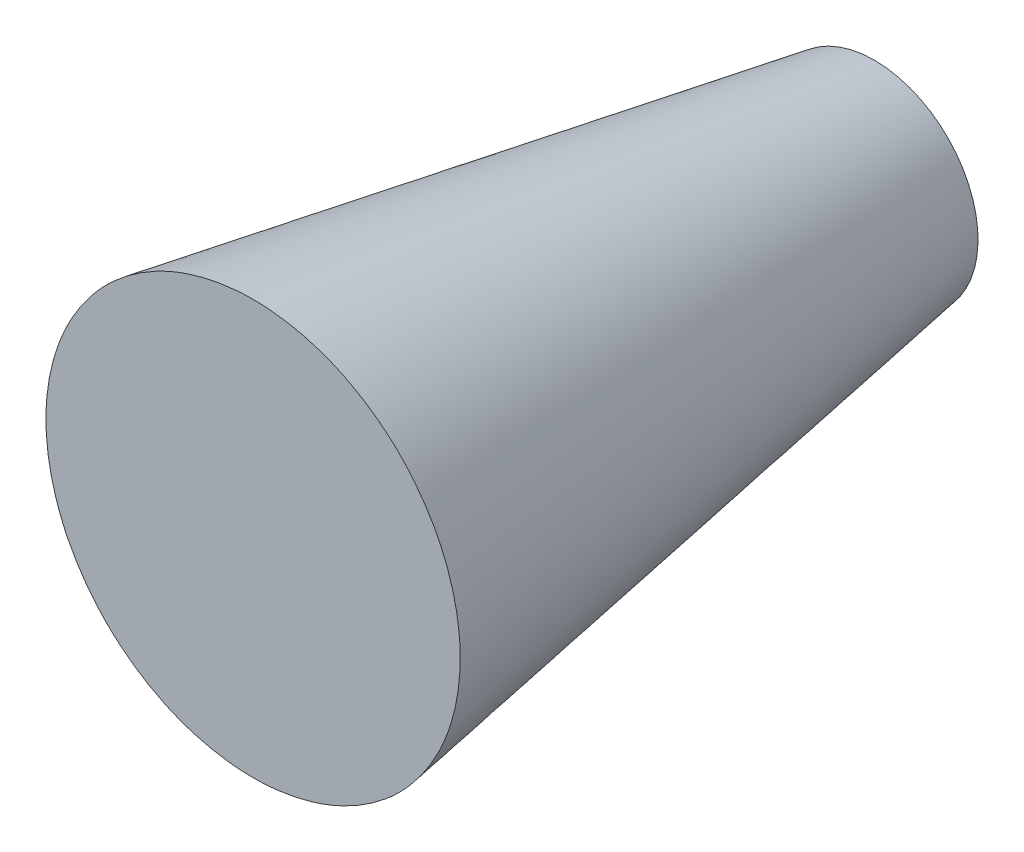
ISO-10303-21;
HEADER;
FILE_DESCRIPTION(('STEP AP214'),'2;1');
FILE_NAME('part.step','',(''),(''),'','','');
FILE_SCHEMA(('AUTOMOTIVE_DESIGN { 1 0 10303 214 1 1 1 1 }'));
ENDSEC;
DATA;
#1=APPLICATION_CONTEXT('core data for automotive mechanical design processes');
#2=APPLICATION_PROTOCOL_DEFINITION('international standard','automotive_design',2000,#1);
#3=PRODUCT_CONTEXT('',#1,'mechanical');
#4=PRODUCT('Part','Part','',(#3));
#5=PRODUCT_RELATED_PRODUCT_CATEGORY('part','',(#4));
#6=PRODUCT_DEFINITION_FORMATION('','',#4);
#7=PRODUCT_DEFINITION_CONTEXT('part definition',#1,'design');
#8=PRODUCT_DEFINITION('design','',#6,#7);
#9=PRODUCT_DEFINITION_SHAPE('','',#8);
#10=(LENGTH_UNIT() NAMED_UNIT(*) SI_UNIT(.MILLI.,.METRE.));
#11=(NAMED_UNIT(*) PLANE_ANGLE_UNIT() SI_UNIT($,.RADIAN.));
#12=(NAMED_UNIT(*) SI_UNIT($,.STERADIAN.) SOLID_ANGLE_UNIT());
#13=UNCERTAINTY_MEASURE_WITH_UNIT(LENGTH_MEASURE(1.E-05),#10,'distance_accuracy_value','');
#14=(GEOMETRIC_REPRESENTATION_CONTEXT(3) GLOBAL_UNCERTAINTY_ASSIGNED_CONTEXT((#13)) GLOBAL_UNIT_ASSIGNED_CONTEXT((#10,
#11,#12)) REPRESENTATION_CONTEXT('',''));
#15=CARTESIAN_POINT('',(0.,0.,0.));
#16=DIRECTION('',(0.,0.,1.));
#17=DIRECTION('',(1.,0.,0.));
#18=AXIS2_PLACEMENT_3D('',#15,#16,#17);
#19=CARTESIAN_POINT('',(0.,0.,30.));
#20=DIRECTION('',(0.,0.,1.));
#21=DIRECTION('',(1.,0.,0.));
#22=AXIS2_PLACEMENT_3D('',#19,#20,#21);
#23=PLANE('',#22);
#24=CARTESIAN_POINT('',(0.,0.,30.));
#25=DIRECTION('',(0.,0.,1.));
#26=DIRECTION('',(1.,0.,0.));
#27=AXIS2_PLACEMENT_3D('',#24,#25,#26);
#28=CIRCLE('',#27,10.);
#29=CARTESIAN_POINT('',(0.,10.,30.));
#30=VERTEX_POINT('',#29);
#31=EDGE_CURVE('E11',#30,#30,#28,.T.);
#32=ORIENTED_EDGE('',*,*,#31,.T.);
#33=EDGE_LOOP('',(#32));
#34=FACE_BOUND('',#33,.T.);
#35=ADVANCED_FACE('F54',(#34),#23,.T.);
#36=CARTESIAN_POINT('',(0.,0.,0.));
#37=DIRECTION('',(0.,0.,1.));
#38=DIRECTION('',(1.,0.,0.));
#39=AXIS2_PLACEMENT_3D('',#36,#37,#38);
#40=PLANE('',#39);
#41=CARTESIAN_POINT('',(0.,0.,0.));
#42=DIRECTION('',(0.,0.,1.));
#43=DIRECTION('',(1.,0.,0.));
#44=AXIS2_PLACEMENT_3D('',#41,#42,#43);
#45=CIRCLE('',#44,5.);
#46=CARTESIAN_POINT('',(0.,5.,0.));
#47=VERTEX_POINT('',#46);
#48=EDGE_CURVE('E62',#47,#47,#45,.T.);
#49=ORIENTED_EDGE('',*,*,#48,.F.);
#50=EDGE_LOOP('',(#49));
#51=FACE_BOUND('',#50,.T.);
#52=ADVANCED_FACE('F88',(#51),#40,.F.);
#53=CARTESIAN_POINT('',(0.,5.,0.));
#54=CARTESIAN_POINT('',(0.,5.83333333333333,5.));
#55=CARTESIAN_POINT('',(0.,7.5,15.));
#56=CARTESIAN_POINT('',(0.,9.16666666666667,25.));
#57=CARTESIAN_POINT('',(0.,10.,30.));
#58=CARTESIAN_POINT('',(-0.65449842988111,5.,0.));
#59=CARTESIAN_POINT('',(-0.763581501527961,5.83333333333333,5.));
#60=CARTESIAN_POINT('',(-0.981747644821664,7.5,15.));
#61=CARTESIAN_POINT('',(-1.19991378811537,9.16666666666667,25.));
#62=CARTESIAN_POINT('',(-1.30899685976222,10.,30.));
#63=CARTESIAN_POINT('',(-1.96322759046434,4.73997693719578,0.));
#64=CARTESIAN_POINT('',(-2.29041709914044,5.52996387236391,4.99999999999999));
#65=CARTESIAN_POINT('',(-2.94479611649264,7.10993774270016,15.));
#66=CARTESIAN_POINT('',(-3.59927835342955,8.68995062372545,25.));
#67=CARTESIAN_POINT('',(-3.92651947189801,9.4799570642381,30.0000000000001));
#68=CARTESIAN_POINT('',(-3.62770947268388,3.62764177346805,0.));
#69=CARTESIAN_POINT('',(-4.23237373783159,4.23225162200864,5.));
#70=CARTESIAN_POINT('',(-5.44170226812701,5.44147131908982,15.));
#71=CARTESIAN_POINT('',(-6.65086692305301,6.65064627778129,25.));
#72=CARTESIAN_POINT('',(-7.25544925051601,7.25523375712702,29.9999999999999));
#73=CARTESIAN_POINT('',(-4.73980084097946,1.96336513223497,0.));
#74=CARTESIAN_POINT('',(-5.52976400198676,2.29055890783169,5.00000000000001));
#75=CARTESIAN_POINT('',(-7.10969032400138,2.94494645902512,15.));
#76=CARTESIAN_POINT('',(-8.68965195799187,3.59942719597622,25.));
#77=CARTESIAN_POINT('',(-9.47963277498711,3.92666756445177,30.));
#78=CARTESIAN_POINT('',(-5.1303561241625,-2.78536823215478E-05,0.));
#79=CARTESIAN_POINT('',(-5.9854202152241,-2.68686971070985E-05,4.99999999999998));
#80=CARTESIAN_POINT('',(-7.6955483973473,-2.48987266782E-05,14.9999999999999));
#81=CARTESIAN_POINT('',(-9.4056455354464,-3.03815408848263E-05,25.));
#82=CARTESIAN_POINT('',(-10.2606941044959,-3.31229479881394E-05,30.));
#83=CARTESIAN_POINT('',(-4.73981396774736,-1.96329873674202,0.));
#84=CARTESIAN_POINT('',(-5.52977856874317,-2.29049415509446,5.00000000000003));
#85=CARTESIAN_POINT('',(-7.10970777073479,-2.94488499179933,15.0000000000001));
#86=CARTESIAN_POINT('',(-8.68966904086446,-3.59935371200881,25.));
#87=CARTESIAN_POINT('',(-9.47964967592929,-3.92658807211355,30.));
#88=CARTESIAN_POINT('',(-3.62767898685821,-3.62774381037552,0.));
#89=CARTESIAN_POINT('',(-4.23233745507116,-4.23235733621182,4.99999999999996));
#90=CARTESIAN_POINT('',(-5.44165439149706,-5.44158438788442,14.9999999999999));
#91=CARTESIAN_POINT('',(-6.6508236260279,-6.65076859176042,24.9999999999999));
#92=CARTESIAN_POINT('',(-7.25540824329332,-7.25536069369841,29.9999999999999));
#93=CARTESIAN_POINT('',(-1.96328740079801,-4.73979499552174,0.));
#94=CARTESIAN_POINT('',(-2.29049118861988,-5.52977057874939,5.00000000000003));
#95=CARTESIAN_POINT('',(-2.94489876426361,-7.10972174520467,15.0000000000001));
#96=CARTESIAN_POINT('',(-3.59937625822339,-8.6897027297687,25.0000000000001));
#97=CARTESIAN_POINT('',(-3.92661500520328,-9.47969322205072,30.));
#98=CARTESIAN_POINT('',(0.,-5.13041395489558,0.));
#99=CARTESIAN_POINT('',(0.,-5.98544474528312,4.99999999999999));
#100=CARTESIAN_POINT('',(0.,-7.69550632605821,15.));
#101=CARTESIAN_POINT('',(0.,-9.40559263459587,25.));
#102=CARTESIAN_POINT('',(0.,-10.2606357888647,30.));
#103=CARTESIAN_POINT('',(1.96328740079802,-4.73979499552175,0.));
#104=CARTESIAN_POINT('',(2.29049118861989,-5.5297705787494,5.));
#105=CARTESIAN_POINT('',(2.94489876426365,-7.1097217452047,15.));
#106=CARTESIAN_POINT('',(3.59937625822341,-8.6897027297687,25.0000000000001));
#107=CARTESIAN_POINT('',(3.92661500520329,-9.4796932220507,30.0000000000001));
#108=CARTESIAN_POINT('',(3.62767898685819,-3.62774381037553,0.));
#109=CARTESIAN_POINT('',(4.23233745507114,-4.23235733621183,5.));
#110=CARTESIAN_POINT('',(5.44165439149704,-5.44158438788442,15.));
#111=CARTESIAN_POINT('',(6.65082362602792,-6.6507685917604,25.));
#112=CARTESIAN_POINT('',(7.25540824329336,-7.25536069369839,29.9999999999999));
#113=CARTESIAN_POINT('',(4.73981396774737,-1.96329873674203,0.));
#114=CARTESIAN_POINT('',(5.52977856874318,-2.29049415509445,5.00000000000001));
#115=CARTESIAN_POINT('',(7.1097077707348,-2.9448849917993,15.));
#116=CARTESIAN_POINT('',(8.68966904086444,-3.5993537120088,25.));
#117=CARTESIAN_POINT('',(9.47964967592925,-3.92658807211356,30.));
#118=CARTESIAN_POINT('',(5.1303561241625,-2.78536823263183E-05,0.));
#119=CARTESIAN_POINT('',(5.9854202152241,-2.68686971099897E-05,4.99999999999998));
#120=CARTESIAN_POINT('',(7.6955483973473,-2.48987266773327E-05,14.9999999999999));
#121=CARTESIAN_POINT('',(9.4056455354464,-3.03815408732614E-05,25.));
#122=CARTESIAN_POINT('',(10.2606941044959,-3.31229479712258E-05,30.));
#123=CARTESIAN_POINT('',(4.73980084097945,1.96336513223497,0.));
#124=CARTESIAN_POINT('',(5.52976400198676,2.29055890783169,5.00000000000002));
#125=CARTESIAN_POINT('',(7.10969032400137,2.94494645902514,15.0000000000001));
#126=CARTESIAN_POINT('',(8.68965195799188,3.59942719597622,25.));
#127=CARTESIAN_POINT('',(9.47963277498713,3.92666756445176,29.9999999999999));
#128=CARTESIAN_POINT('',(3.62770947268389,3.62764177346805,0.));
#129=CARTESIAN_POINT('',(4.2323737378316,4.23225162200864,4.99999999999998));
#130=CARTESIAN_POINT('',(5.44170226812703,5.44147131908981,14.9999999999999));
#131=CARTESIAN_POINT('',(6.65086692305299,6.6506462777813,25.));
#132=CARTESIAN_POINT('',(7.25544925051597,7.25523375712704,30.));
#133=CARTESIAN_POINT('',(1.96322759046434,4.73997693719579,0.));
#134=CARTESIAN_POINT('',(2.29041709914043,5.52996387236391,5.00000000000001));
#135=CARTESIAN_POINT('',(2.94479611649262,7.10993774270015,15.));
#136=CARTESIAN_POINT('',(3.59927835342957,8.68995062372544,25.));
#137=CARTESIAN_POINT('',(3.92651947189804,9.47995706423809,30.));
#138=CARTESIAN_POINT('',(0.65449842988111,5.,0.));
#139=CARTESIAN_POINT('',(0.763581501527961,5.83333333333333,5.));
#140=CARTESIAN_POINT('',(0.981747644821663,7.5,15.));
#141=CARTESIAN_POINT('',(1.19991378811537,9.16666666666667,25.));
#142=CARTESIAN_POINT('',(1.30899685976222,10.,30.));
#143=CARTESIAN_POINT('',(0.,5.,0.));
#144=CARTESIAN_POINT('',(0.,5.83333333333333,5.));
#145=CARTESIAN_POINT('',(0.,7.5,15.));
#146=CARTESIAN_POINT('',(0.,9.16666666666667,25.));
#147=CARTESIAN_POINT('',(0.,10.,30.));
#148=B_SPLINE_SURFACE_WITH_KNOTS('',3,3,((#53,#54,#55,#56,#57),(#58,#59,#60,#61,#62),(#63,#64,
#65,#66,#67),(#68,#69,#70,#71,#72),(#73,#74,#75,#76,#77),(#78,#79,#80,#81,#82),(#83,#84,#85,#86,
#87),(#88,#89,#90,#91,#92),(#93,#94,#95,#96,#97),(#98,#99,#100,#101,#102),(#103,#104,#105,#106,
#107),(#108,#109,#110,#111,#112),(#113,#114,#115,#116,#117),(#118,#119,#120,#121,#122),(#123,
#124,#125,#126,#127),(#128,#129,#130,#131,#132),(#133,#134,#135,#136,#137),(#138,#139,#140,#141,
#142),(#143,#144,#145,#146,#147)),.UNSPECIFIED.,.T.,.F.,.F.,(4,1,1,1,1,1,1,1,1,1,1,1,1,1,1,1,4),
(4,1,4),(0.,0.0625,0.125,0.1875,0.25,0.3125,0.375,0.4375,0.5,0.5625,0.625,0.6875,0.75,0.8125,
0.875,0.9375,1.),(0.,0.5,1.),.UNSPECIFIED.);
#149=CARTESIAN_POINT('',(0.,5.,0.));
#150=CARTESIAN_POINT('',(0.,5.05208333333333,0.3125));
#151=CARTESIAN_POINT('',(0.,5.10416666666667,0.625));
#152=CARTESIAN_POINT('',(0.,5.20833333333333,1.25));
#153=CARTESIAN_POINT('',(0.,5.26041666666667,1.5625));
#154=CARTESIAN_POINT('',(0.,5.36458333333333,2.1875));
#155=CARTESIAN_POINT('',(0.,5.41666666666667,2.5));
#156=CARTESIAN_POINT('',(0.,5.52083333333333,3.125));
#157=CARTESIAN_POINT('',(0.,5.57291666666667,3.4375));
#158=CARTESIAN_POINT('',(0.,5.67708333333333,4.0625));
#159=CARTESIAN_POINT('',(0.,5.72916666666667,4.375));
#160=CARTESIAN_POINT('',(0.,5.83333333333333,5.));
#161=CARTESIAN_POINT('',(0.,5.88541666666666,5.3125));
#162=CARTESIAN_POINT('',(0.,5.98958333333333,5.9375));
#163=CARTESIAN_POINT('',(0.,6.04166666666667,6.25));
#164=CARTESIAN_POINT('',(0.,6.14583333333333,6.875));
#165=CARTESIAN_POINT('',(0.,6.19791666666667,7.1875));
#166=CARTESIAN_POINT('',(0.,6.30208333333333,7.8125));
#167=CARTESIAN_POINT('',(0.,6.35416666666667,8.125));
#168=CARTESIAN_POINT('',(0.,6.45833333333333,8.75));
#169=CARTESIAN_POINT('',(0.,6.51041666666667,9.0625));
#170=CARTESIAN_POINT('',(0.,6.61458333333333,9.6875));
#171=CARTESIAN_POINT('',(0.,6.66666666666667,10.));
#172=CARTESIAN_POINT('',(0.,6.77083333333333,10.625));
#173=CARTESIAN_POINT('',(0.,6.82291666666667,10.9375));
#174=CARTESIAN_POINT('',(0.,6.92708333333333,11.5625));
#175=CARTESIAN_POINT('',(0.,6.97916666666667,11.875));
#176=CARTESIAN_POINT('',(0.,7.08333333333333,12.5));
#177=CARTESIAN_POINT('',(0.,7.13541666666667,12.8125));
#178=CARTESIAN_POINT('',(0.,7.23958333333333,13.4375));
#179=CARTESIAN_POINT('',(0.,7.29166666666667,13.75));
#180=CARTESIAN_POINT('',(0.,7.39583333333333,14.375));
#181=CARTESIAN_POINT('',(0.,7.44791666666667,14.6875));
#182=CARTESIAN_POINT('',(0.,7.55208333333333,15.3125));
#183=CARTESIAN_POINT('',(0.,7.60416666666667,15.625));
#184=CARTESIAN_POINT('',(0.,7.70833333333333,16.25));
#185=CARTESIAN_POINT('',(0.,7.76041666666667,16.5625));
#186=CARTESIAN_POINT('',(0.,7.86458333333333,17.1875));
#187=CARTESIAN_POINT('',(0.,7.91666666666667,17.5));
#188=CARTESIAN_POINT('',(0.,8.02083333333333,18.125));
#189=CARTESIAN_POINT('',(0.,8.07291666666667,18.4375));
#190=CARTESIAN_POINT('',(0.,8.17708333333333,19.0625));
#191=CARTESIAN_POINT('',(0.,8.22916666666667,19.375));
#192=CARTESIAN_POINT('',(0.,8.33333333333333,20.));
#193=CARTESIAN_POINT('',(0.,8.38541666666667,20.3125));
#194=CARTESIAN_POINT('',(0.,8.48958333333333,20.9375));
#195=CARTESIAN_POINT('',(0.,8.54166666666667,21.25));
#196=CARTESIAN_POINT('',(0.,8.64583333333333,21.875));
#197=CARTESIAN_POINT('',(0.,8.69791666666667,22.1875));
#198=CARTESIAN_POINT('',(0.,8.80208333333333,22.8125));
#199=CARTESIAN_POINT('',(0.,8.85416666666667,23.125));
#200=CARTESIAN_POINT('',(0.,8.95833333333333,23.75));
#201=CARTESIAN_POINT('',(0.,9.01041666666667,24.0625));
#202=CARTESIAN_POINT('',(0.,9.11458333333333,24.6875));
#203=CARTESIAN_POINT('',(0.,9.16666666666667,25.));
#204=CARTESIAN_POINT('',(0.,9.27083333333333,25.625));
#205=CARTESIAN_POINT('',(0.,9.32291666666667,25.9375));
#206=CARTESIAN_POINT('',(0.,9.42708333333333,26.5625));
#207=CARTESIAN_POINT('',(0.,9.47916666666667,26.875));
#208=CARTESIAN_POINT('',(0.,9.58333333333333,27.5));
#209=CARTESIAN_POINT('',(0.,9.63541666666667,27.8125));
#210=CARTESIAN_POINT('',(0.,9.73958333333333,28.4375));
#211=CARTESIAN_POINT('',(0.,9.79166666666667,28.75));
#212=CARTESIAN_POINT('',(0.,9.89583333333333,29.375));
#213=CARTESIAN_POINT('',(0.,9.94791666666666,29.6875));
#214=CARTESIAN_POINT('',(0.,10.,30.));
#215=B_SPLINE_CURVE_WITH_KNOTS('',3,(#149,#150,#151,#152,#153,#154,#155,#156,#157,#158,#159,
#160,#161,#162,#163,#164,#165,#166,#167,#168,#169,#170,#171,#172,#173,#174,#175,#176,#177,#178,
#179,#180,#181,#182,#183,#184,#185,#186,#187,#188,#189,#190,#191,#192,#193,#194,#195,#196,#197,
#198,#199,#200,#201,#202,#203,#204,#205,#206,#207,#208,#209,#210,#211,#212,#213,#214),
.UNSPECIFIED.,.F.,.F.,(4,2,2,2,2,2,2,2,2,2,2,2,2,2,2,2,2,2,2,2,2,2,2,2,2,2,2,2,2,2,2,2,4),(0.,
0.950431645359097,1.90086329071819,2.85129493607729,3.80172658143639,4.75215822679548,
5.70258987215458,6.65302151751368,7.60345316287277,8.55388480823187,9.50431645359096,
10.4547480989501,11.4051797443092,12.3556113896683,13.3060430350274,14.2564746803865,
15.2069063257455,16.1573379711046,17.1077696164637,18.0582012618228,19.0086329071819,
19.959064552541,20.9094961979001,21.8599278432592,22.8103594886183,23.7607911339774,
24.7112227793365,25.6616544246956,26.6120860700547,27.5625177154138,28.5129493607729,
29.463381006132,30.4138126514911),.UNSPECIFIED.);
#216=EDGE_CURVE('BSEAM94',#47,#30,#215,.T.);
#217=ORIENTED_EDGE('',*,*,#48,.T.);
#218=ORIENTED_EDGE('',*,*,#31,.F.);
#219=ORIENTED_EDGE('',*,*,#216,.T.);
#220=ORIENTED_EDGE('',*,*,#216,.F.);
#221=EDGE_LOOP('',(#217,#219,#218,#220));
#222=FACE_BOUND('',#221,.T.);
#223=ADVANCED_FACE('F94',(#222),#148,.T.);
#224=CLOSED_SHELL('',(#35,#52,#223));
#225=MANIFOLD_SOLID_BREP('B2',#224);
#226=ADVANCED_BREP_SHAPE_REPRESENTATION('',(#18,#225),#14);
#227=SHAPE_DEFINITION_REPRESENTATION(#9,#226);
ENDSEC;
END-ISO-10303-21;
